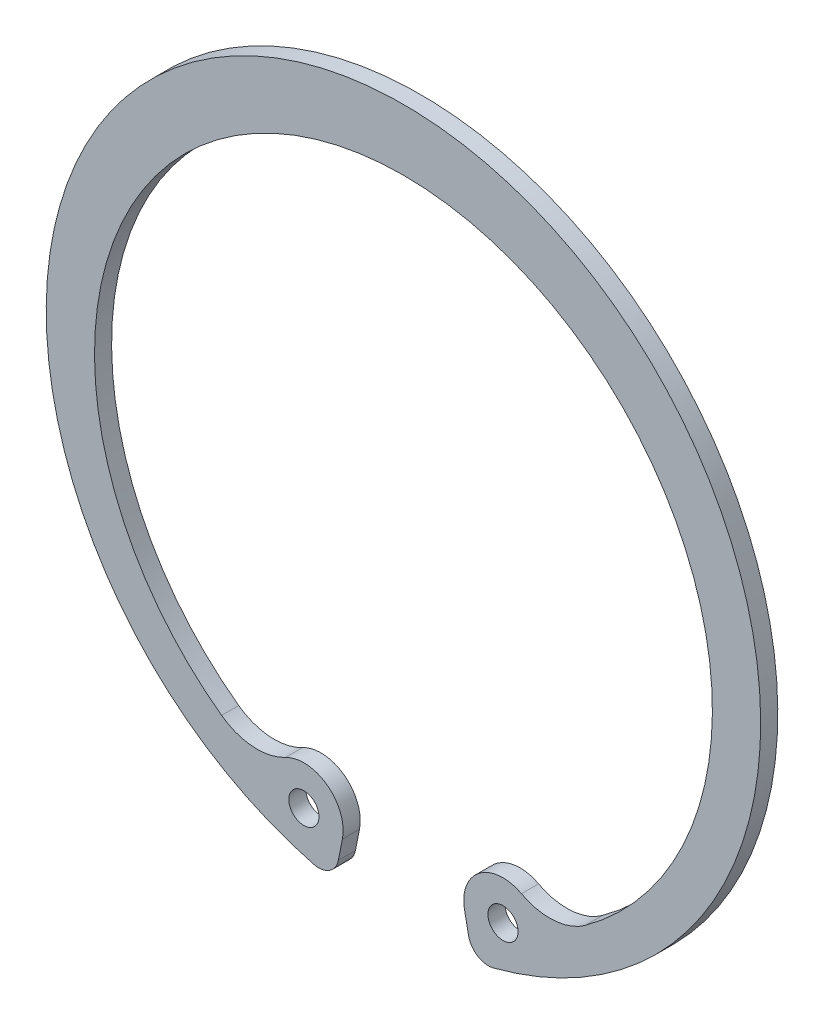
ISO-10303-21;
HEADER;
FILE_DESCRIPTION(('STEP AP214'),'2;1');
FILE_NAME('part.step','',(''),(''),'','','');
FILE_SCHEMA(('AUTOMOTIVE_DESIGN { 1 0 10303 214 1 1 1 1 }'));
ENDSEC;
DATA;
#1=APPLICATION_CONTEXT('core data for automotive mechanical design processes');
#2=APPLICATION_PROTOCOL_DEFINITION('international standard','automotive_design',2000,#1);
#3=PRODUCT_CONTEXT('',#1,'mechanical');
#4=PRODUCT('Part','Part','',(#3));
#5=PRODUCT_RELATED_PRODUCT_CATEGORY('part','',(#4));
#6=PRODUCT_DEFINITION_FORMATION('','',#4);
#7=PRODUCT_DEFINITION_CONTEXT('part definition',#1,'design');
#8=PRODUCT_DEFINITION('design','',#6,#7);
#9=PRODUCT_DEFINITION_SHAPE('','',#8);
#10=(LENGTH_UNIT() NAMED_UNIT(*) SI_UNIT(.MILLI.,.METRE.));
#11=(NAMED_UNIT(*) PLANE_ANGLE_UNIT() SI_UNIT($,.RADIAN.));
#12=(NAMED_UNIT(*) SI_UNIT($,.STERADIAN.) SOLID_ANGLE_UNIT());
#13=UNCERTAINTY_MEASURE_WITH_UNIT(LENGTH_MEASURE(1.E-05),#10,'distance_accuracy_value','');
#14=(GEOMETRIC_REPRESENTATION_CONTEXT(3) GLOBAL_UNCERTAINTY_ASSIGNED_CONTEXT((#13)) GLOBAL_UNIT_ASSIGNED_CONTEXT((#10,
#11,#12)) REPRESENTATION_CONTEXT('',''));
#15=CARTESIAN_POINT('',(0.,0.,0.));
#16=DIRECTION('',(0.,0.,1.));
#17=DIRECTION('',(1.,0.,0.));
#18=AXIS2_PLACEMENT_3D('',#15,#16,#17);
#19=CARTESIAN_POINT('',(-14.5407425987536,-21.2708650477625,1.7));
#20=DIRECTION('',(0.,0.,1.));
#21=DIRECTION('',(1.,0.,0.));
#22=AXIS2_PLACEMENT_3D('',#19,#20,#21);
#23=PLANE('',#22);
#24=CARTESIAN_POINT('',(-9.89414741037491,-30.012669961814,1.7));
#25=DIRECTION('',(0.,0.,1.));
#26=DIRECTION('',(1.,0.,0.));
#27=AXIS2_PLACEMENT_3D('',#24,#25,#26);
#28=CIRCLE('',#27,1.5);
#29=CARTESIAN_POINT('',(-8.39414741037491,-30.012669961814,1.7));
#30=VERTEX_POINT('',#29);
#31=EDGE_CURVE('E147',#30,#30,#28,.T.);
#32=ORIENTED_EDGE('',*,*,#31,.F.);
#33=EDGE_LOOP('',(#32));
#34=FACE_BOUND('',#33,.T.);
#35=CARTESIAN_POINT('',(-14.5407425987536,-21.2708650477625,1.7));
#36=DIRECTION('',(0.,0.,-1.));
#37=DIRECTION('',(1.,0.,0.));
#38=AXIS2_PLACEMENT_3D('',#35,#36,#37);
#39=CIRCLE('',#38,6.00000000000003);
#40=CARTESIAN_POINT('',(-11.7246243027665,-26.5689286320362,1.7));
#41=VERTEX_POINT('',#40);
#42=CARTESIAN_POINT('',(-18.0726208705647,-26.1212089400148,1.7));
#43=VERTEX_POINT('',#42);
#44=EDGE_CURVE('E162',#41,#43,#39,.T.);
#45=ORIENTED_EDGE('',*,*,#44,.T.);
#46=CARTESIAN_POINT('',(0.,-1.30199958159483,1.7));
#47=DIRECTION('',(0.,0.,-1.));
#48=DIRECTION('',(1.,0.,0.));
#49=AXIS2_PLACEMENT_3D('',#46,#47,#48);
#50=CIRCLE('',#49,30.7019995815949);
#51=CARTESIAN_POINT('',(18.0726208705647,-26.1212089400148,1.7));
#52=VERTEX_POINT('',#51);
#53=EDGE_CURVE('E100',#43,#52,#50,.T.);
#54=ORIENTED_EDGE('',*,*,#53,.T.);
#55=CARTESIAN_POINT('',(14.5407425987536,-21.2708650477625,1.7));
#56=DIRECTION('',(0.,0.,-1.));
#57=DIRECTION('',(-1.,0.,0.));
#58=AXIS2_PLACEMENT_3D('',#55,#56,#57);
#59=CIRCLE('',#58,6.00000000000003);
#60=CARTESIAN_POINT('',(11.7246243027665,-26.5689286320362,1.7));
#61=VERTEX_POINT('',#60);
#62=EDGE_CURVE('E183',#52,#61,#59,.T.);
#63=ORIENTED_EDGE('',*,*,#62,.T.);
#64=CARTESIAN_POINT('',(9.89414741037491,-30.012669961814,1.7));
#65=DIRECTION('',(0.,0.,1.));
#66=DIRECTION('',(-1.,0.,0.));
#67=AXIS2_PLACEMENT_3D('',#64,#65,#66);
#68=CIRCLE('',#67,3.9);
#69=CARTESIAN_POINT('',(6.06890658915215,-30.7726256576615,1.7));
#70=VERTEX_POINT('',#69);
#71=EDGE_CURVE('E202',#61,#70,#68,.T.);
#72=ORIENTED_EDGE('',*,*,#71,.T.);
#73=DIRECTION('',(0.194860434832676,-0.98083097980071,0.));
#74=VECTOR('',#73,1.);
#75=CARTESIAN_POINT('',(6.47372941912589,-32.8103034105096,1.7));
#76=LINE('',#75,#74);
#77=CARTESIAN_POINT('',(6.47372941912589,-32.8103034105096,1.7));
#78=VERTEX_POINT('',#77);
#79=EDGE_CURVE('E199',#70,#78,#76,.T.);
#80=ORIENTED_EDGE('',*,*,#79,.T.);
#81=CARTESIAN_POINT('',(8.43539137872731,-32.4205825408442,1.7));
#82=DIRECTION('',(0.,0.,1.));
#83=DIRECTION('',(-1.,0.,0.));
#84=AXIS2_PLACEMENT_3D('',#81,#82,#83);
#85=CIRCLE('',#84,2.);
#86=CARTESIAN_POINT('',(8.93899683417372,-34.3561397074618,1.7));
#87=VERTEX_POINT('',#86);
#88=EDGE_CURVE('E201',#78,#87,#85,.T.);
#89=ORIENTED_EDGE('',*,*,#88,.T.);
#90=CARTESIAN_POINT('',(0.,0.,1.7));
#91=DIRECTION('',(0.,0.,1.));
#92=DIRECTION('',(1.,0.,0.));
#93=AXIS2_PLACEMENT_3D('',#90,#91,#92);
#94=CIRCLE('',#93,35.5);
#95=CARTESIAN_POINT('',(-8.93899683417372,-34.3561397074618,1.7));
#96=VERTEX_POINT('',#95);
#97=EDGE_CURVE('E125',#87,#96,#94,.T.);
#98=ORIENTED_EDGE('',*,*,#97,.T.);
#99=CARTESIAN_POINT('',(-8.43539137872731,-32.4205825408442,1.7));
#100=DIRECTION('',(0.,0.,1.));
#101=DIRECTION('',(1.,0.,0.));
#102=AXIS2_PLACEMENT_3D('',#99,#100,#101);
#103=CIRCLE('',#102,2.);
#104=CARTESIAN_POINT('',(-6.47372941912589,-32.8103034105096,1.7));
#105=VERTEX_POINT('',#104);
#106=EDGE_CURVE('E119',#96,#105,#103,.T.);
#107=ORIENTED_EDGE('',*,*,#106,.T.);
#108=DIRECTION('',(0.194860434832676,0.98083097980071,0.));
#109=VECTOR('',#108,1.);
#110=CARTESIAN_POINT('',(-6.47372941912589,-32.8103034105096,1.7));
#111=LINE('',#110,#109);
#112=CARTESIAN_POINT('',(-6.06890658915215,-30.7726256576615,1.7));
#113=VERTEX_POINT('',#112);
#114=EDGE_CURVE('E123',#105,#113,#111,.T.);
#115=ORIENTED_EDGE('',*,*,#114,.T.);
#116=CARTESIAN_POINT('',(-9.89414741037491,-30.012669961814,1.7));
#117=DIRECTION('',(0.,0.,1.));
#118=DIRECTION('',(1.,0.,0.));
#119=AXIS2_PLACEMENT_3D('',#116,#117,#118);
#120=CIRCLE('',#119,3.9);
#121=EDGE_CURVE('E51',#113,#41,#120,.T.);
#122=ORIENTED_EDGE('',*,*,#121,.T.);
#123=EDGE_LOOP('',(#45,#54,#63,#72,#80,#89,#98,#107,#115,#122));
#124=FACE_BOUND('',#123,.T.);
#125=CARTESIAN_POINT('',(9.89414741037491,-30.012669961814,1.7));
#126=DIRECTION('',(0.,0.,1.));
#127=DIRECTION('',(-1.,0.,0.));
#128=AXIS2_PLACEMENT_3D('',#125,#126,#127);
#129=CIRCLE('',#128,1.5);
#130=CARTESIAN_POINT('',(8.39414741037491,-30.012669961814,1.7));
#131=VERTEX_POINT('',#130);
#132=EDGE_CURVE('E213',#131,#131,#129,.T.);
#133=ORIENTED_EDGE('',*,*,#132,.F.);
#134=EDGE_LOOP('',(#133));
#135=FACE_BOUND('',#134,.T.);
#136=ADVANCED_FACE('F34',(#34,#124,#135),#23,.T.);
#137=CARTESIAN_POINT('',(-14.5407425987536,-21.2708650477625,0.));
#138=DIRECTION('',(0.,0.,1.));
#139=DIRECTION('',(1.,0.,0.));
#140=AXIS2_PLACEMENT_3D('',#137,#138,#139);
#141=PLANE('',#140);
#142=CARTESIAN_POINT('',(-14.5407425987536,-21.2708650477625,0.));
#143=DIRECTION('',(0.,0.,-1.));
#144=DIRECTION('',(1.,0.,0.));
#145=AXIS2_PLACEMENT_3D('',#142,#143,#144);
#146=CIRCLE('',#145,6.00000000000003);
#147=CARTESIAN_POINT('',(-11.7246243027665,-26.5689286320362,0.));
#148=VERTEX_POINT('',#147);
#149=CARTESIAN_POINT('',(-18.0726208705647,-26.1212089400148,0.));
#150=VERTEX_POINT('',#149);
#151=EDGE_CURVE('E143',#148,#150,#146,.T.);
#152=ORIENTED_EDGE('',*,*,#151,.F.);
#153=CARTESIAN_POINT('',(-9.89414741037491,-30.012669961814,0.));
#154=DIRECTION('',(0.,0.,1.));
#155=DIRECTION('',(1.,0.,0.));
#156=AXIS2_PLACEMENT_3D('',#153,#154,#155);
#157=CIRCLE('',#156,3.9);
#158=CARTESIAN_POINT('',(-6.06890658915215,-30.7726256576615,0.));
#159=VERTEX_POINT('',#158);
#160=EDGE_CURVE('E92',#159,#148,#157,.T.);
#161=ORIENTED_EDGE('',*,*,#160,.F.);
#162=DIRECTION('',(0.194860434832676,0.98083097980071,0.));
#163=VECTOR('',#162,1.);
#164=CARTESIAN_POINT('',(-6.47372941912589,-32.8103034105096,0.));
#165=LINE('',#164,#163);
#166=CARTESIAN_POINT('',(-6.47372941912589,-32.8103034105096,0.));
#167=VERTEX_POINT('',#166);
#168=EDGE_CURVE('E86',#167,#159,#165,.T.);
#169=ORIENTED_EDGE('',*,*,#168,.F.);
#170=CARTESIAN_POINT('',(-8.43539137872731,-32.4205825408442,0.));
#171=DIRECTION('',(0.,0.,1.));
#172=DIRECTION('',(1.,0.,0.));
#173=AXIS2_PLACEMENT_3D('',#170,#171,#172);
#174=CIRCLE('',#173,2.);
#175=CARTESIAN_POINT('',(-8.93899683417372,-34.3561397074618,0.));
#176=VERTEX_POINT('',#175);
#177=EDGE_CURVE('E133',#176,#167,#174,.T.);
#178=ORIENTED_EDGE('',*,*,#177,.F.);
#179=CARTESIAN_POINT('',(0.,0.,0.));
#180=DIRECTION('',(0.,0.,1.));
#181=DIRECTION('',(1.,0.,0.));
#182=AXIS2_PLACEMENT_3D('',#179,#180,#181);
#183=CIRCLE('',#182,35.5);
#184=CARTESIAN_POINT('',(8.93899683417372,-34.3561397074618,0.));
#185=VERTEX_POINT('',#184);
#186=EDGE_CURVE('E157',#185,#176,#183,.T.);
#187=ORIENTED_EDGE('',*,*,#186,.F.);
#188=CARTESIAN_POINT('',(8.43539137872731,-32.4205825408442,0.));
#189=DIRECTION('',(0.,0.,1.));
#190=DIRECTION('',(-1.,0.,0.));
#191=AXIS2_PLACEMENT_3D('',#188,#189,#190);
#192=CIRCLE('',#191,2.);
#193=CARTESIAN_POINT('',(6.47372941912589,-32.8103034105096,0.));
#194=VERTEX_POINT('',#193);
#195=EDGE_CURVE('E155',#194,#185,#192,.T.);
#196=ORIENTED_EDGE('',*,*,#195,.F.);
#197=DIRECTION('',(0.194860434832676,-0.98083097980071,0.));
#198=VECTOR('',#197,1.);
#199=CARTESIAN_POINT('',(6.47372941912589,-32.8103034105096,0.));
#200=LINE('',#199,#198);
#201=CARTESIAN_POINT('',(6.06890658915215,-30.7726256576615,0.));
#202=VERTEX_POINT('',#201);
#203=EDGE_CURVE('E153',#202,#194,#200,.T.);
#204=ORIENTED_EDGE('',*,*,#203,.F.);
#205=CARTESIAN_POINT('',(9.89414741037491,-30.012669961814,0.));
#206=DIRECTION('',(0.,0.,1.));
#207=DIRECTION('',(-1.,0.,0.));
#208=AXIS2_PLACEMENT_3D('',#205,#206,#207);
#209=CIRCLE('',#208,3.9);
#210=CARTESIAN_POINT('',(11.7246243027665,-26.5689286320362,0.));
#211=VERTEX_POINT('',#210);
#212=EDGE_CURVE('E151',#211,#202,#209,.T.);
#213=ORIENTED_EDGE('',*,*,#212,.F.);
#214=CARTESIAN_POINT('',(14.5407425987536,-21.2708650477625,0.));
#215=DIRECTION('',(0.,0.,-1.));
#216=DIRECTION('',(-1.,0.,0.));
#217=AXIS2_PLACEMENT_3D('',#214,#215,#216);
#218=CIRCLE('',#217,6.00000000000003);
#219=CARTESIAN_POINT('',(18.0726208705647,-26.1212089400148,0.));
#220=VERTEX_POINT('',#219);
#221=EDGE_CURVE('E149',#220,#211,#218,.T.);
#222=ORIENTED_EDGE('',*,*,#221,.F.);
#223=CARTESIAN_POINT('',(0.,-1.30199958159483,0.));
#224=DIRECTION('',(0.,0.,-1.));
#225=DIRECTION('',(1.,0.,0.));
#226=AXIS2_PLACEMENT_3D('',#223,#224,#225);
#227=CIRCLE('',#226,30.7019995815949);
#228=EDGE_CURVE('E146',#150,#220,#227,.T.);
#229=ORIENTED_EDGE('',*,*,#228,.F.);
#230=EDGE_LOOP('',(#152,#161,#169,#178,#187,#196,#204,#213,#222,#229));
#231=FACE_BOUND('',#230,.T.);
#232=CARTESIAN_POINT('',(-9.89414741037491,-30.012669961814,0.));
#233=DIRECTION('',(0.,0.,1.));
#234=DIRECTION('',(1.,0.,0.));
#235=AXIS2_PLACEMENT_3D('',#232,#233,#234);
#236=CIRCLE('',#235,1.5);
#237=CARTESIAN_POINT('',(-8.39414741037491,-30.012669961814,0.));
#238=VERTEX_POINT('',#237);
#239=EDGE_CURVE('E210',#238,#238,#236,.T.);
#240=ORIENTED_EDGE('',*,*,#239,.T.);
#241=EDGE_LOOP('',(#240));
#242=FACE_BOUND('',#241,.T.);
#243=CARTESIAN_POINT('',(9.89414741037491,-30.012669961814,0.));
#244=DIRECTION('',(0.,0.,1.));
#245=DIRECTION('',(-1.,0.,0.));
#246=AXIS2_PLACEMENT_3D('',#243,#244,#245);
#247=CIRCLE('',#246,1.5);
#248=CARTESIAN_POINT('',(8.39414741037491,-30.012669961814,0.));
#249=VERTEX_POINT('',#248);
#250=EDGE_CURVE('E216',#249,#249,#247,.T.);
#251=ORIENTED_EDGE('',*,*,#250,.T.);
#252=EDGE_LOOP('',(#251));
#253=FACE_BOUND('',#252,.T.);
#254=ADVANCED_FACE('F187',(#231,#242,#253),#141,.F.);
#255=CARTESIAN_POINT('',(-14.5407425987536,-21.2708650477625,1.7));
#256=DIRECTION('',(0.,0.,-1.));
#257=DIRECTION('',(-1.,0.,0.));
#258=AXIS2_PLACEMENT_3D('',#255,#256,#257);
#259=CYLINDRICAL_SURFACE('',#258,6.00000000000003);
#260=ORIENTED_EDGE('',*,*,#151,.T.);
#261=DIRECTION('',(0.,0.,-1.));
#262=VECTOR('',#261,1.);
#263=CARTESIAN_POINT('',(-18.0726208705647,-26.1212089400148,1.7));
#264=LINE('',#263,#262);
#265=EDGE_CURVE('E11',#43,#150,#264,.T.);
#266=ORIENTED_EDGE('',*,*,#265,.F.);
#267=ORIENTED_EDGE('',*,*,#44,.F.);
#268=DIRECTION('',(0.,0.,-1.));
#269=VECTOR('',#268,1.);
#270=CARTESIAN_POINT('',(-11.7246243027665,-26.5689286320362,1.7));
#271=LINE('',#270,#269);
#272=EDGE_CURVE('E139',#41,#148,#271,.T.);
#273=ORIENTED_EDGE('',*,*,#272,.T.);
#274=EDGE_LOOP('',(#260,#266,#267,#273));
#275=FACE_BOUND('',#274,.T.);
#276=ADVANCED_FACE('F36',(#275),#259,.F.);
#277=CARTESIAN_POINT('',(0.,-1.30199958159483,1.7));
#278=DIRECTION('',(0.,0.,-1.));
#279=DIRECTION('',(-1.,0.,0.));
#280=AXIS2_PLACEMENT_3D('',#277,#278,#279);
#281=CYLINDRICAL_SURFACE('',#280,30.7019995815949);
#282=ORIENTED_EDGE('',*,*,#228,.T.);
#283=DIRECTION('',(0.,0.,-1.));
#284=VECTOR('',#283,1.);
#285=CARTESIAN_POINT('',(18.0726208705647,-26.1212089400148,1.7));
#286=LINE('',#285,#284);
#287=EDGE_CURVE('E43',#52,#220,#286,.T.);
#288=ORIENTED_EDGE('',*,*,#287,.F.);
#289=ORIENTED_EDGE('',*,*,#53,.F.);
#290=ORIENTED_EDGE('',*,*,#265,.T.);
#291=EDGE_LOOP('',(#282,#288,#289,#290));
#292=FACE_BOUND('',#291,.T.);
#293=ADVANCED_FACE('F256',(#292),#281,.F.);
#294=CARTESIAN_POINT('',(14.5407425987536,-21.2708650477625,1.7));
#295=DIRECTION('',(0.,0.,-1.));
#296=DIRECTION('',(-1.,0.,0.));
#297=AXIS2_PLACEMENT_3D('',#294,#295,#296);
#298=CYLINDRICAL_SURFACE('',#297,6.00000000000003);
#299=ORIENTED_EDGE('',*,*,#221,.T.);
#300=DIRECTION('',(0.,0.,-1.));
#301=VECTOR('',#300,1.);
#302=CARTESIAN_POINT('',(11.7246243027665,-26.5689286320362,1.7));
#303=LINE('',#302,#301);
#304=EDGE_CURVE('E175',#61,#211,#303,.T.);
#305=ORIENTED_EDGE('',*,*,#304,.F.);
#306=ORIENTED_EDGE('',*,*,#62,.F.);
#307=ORIENTED_EDGE('',*,*,#287,.T.);
#308=EDGE_LOOP('',(#299,#305,#306,#307));
#309=FACE_BOUND('',#308,.T.);
#310=ADVANCED_FACE('F181',(#309),#298,.F.);
#311=CARTESIAN_POINT('',(9.89414741037491,-30.012669961814,1.7));
#312=DIRECTION('',(0.,0.,-1.));
#313=DIRECTION('',(-1.,0.,0.));
#314=AXIS2_PLACEMENT_3D('',#311,#312,#313);
#315=CYLINDRICAL_SURFACE('',#314,3.9);
#316=ORIENTED_EDGE('',*,*,#212,.T.);
#317=DIRECTION('',(0.,0.,-1.));
#318=VECTOR('',#317,1.);
#319=CARTESIAN_POINT('',(6.06890658915215,-30.7726256576615,1.7));
#320=LINE('',#319,#318);
#321=EDGE_CURVE('E172',#70,#202,#320,.T.);
#322=ORIENTED_EDGE('',*,*,#321,.F.);
#323=ORIENTED_EDGE('',*,*,#71,.F.);
#324=ORIENTED_EDGE('',*,*,#304,.T.);
#325=EDGE_LOOP('',(#316,#322,#323,#324));
#326=FACE_BOUND('',#325,.T.);
#327=ADVANCED_FACE('F193',(#326),#315,.T.);
#328=CARTESIAN_POINT('',(6.47372941912589,-32.8103034105096,1.7));
#329=DIRECTION('',(0.98083097980071,0.194860434832676,0.));
#330=DIRECTION('',(-0.194860434832676,0.98083097980071,0.));
#331=AXIS2_PLACEMENT_3D('',#328,#329,#330);
#332=PLANE('',#331);
#333=ORIENTED_EDGE('',*,*,#203,.T.);
#334=DIRECTION('',(0.,0.,-1.));
#335=VECTOR('',#334,1.);
#336=CARTESIAN_POINT('',(6.47372941912589,-32.8103034105096,1.7));
#337=LINE('',#336,#335);
#338=EDGE_CURVE('E169',#78,#194,#337,.T.);
#339=ORIENTED_EDGE('',*,*,#338,.F.);
#340=ORIENTED_EDGE('',*,*,#79,.F.);
#341=ORIENTED_EDGE('',*,*,#321,.T.);
#342=EDGE_LOOP('',(#333,#339,#340,#341));
#343=FACE_BOUND('',#342,.T.);
#344=ADVANCED_FACE('F197',(#343),#332,.F.);
#345=CARTESIAN_POINT('',(8.43539137872731,-32.4205825408442,1.7));
#346=DIRECTION('',(0.,0.,-1.));
#347=DIRECTION('',(-1.,0.,0.));
#348=AXIS2_PLACEMENT_3D('',#345,#346,#347);
#349=CYLINDRICAL_SURFACE('',#348,2.);
#350=ORIENTED_EDGE('',*,*,#195,.T.);
#351=DIRECTION('',(0.,0.,-1.));
#352=VECTOR('',#351,1.);
#353=CARTESIAN_POINT('',(8.93899683417372,-34.3561397074618,1.7));
#354=LINE('',#353,#352);
#355=EDGE_CURVE('E166',#87,#185,#354,.T.);
#356=ORIENTED_EDGE('',*,*,#355,.F.);
#357=ORIENTED_EDGE('',*,*,#88,.F.);
#358=ORIENTED_EDGE('',*,*,#338,.T.);
#359=EDGE_LOOP('',(#350,#356,#357,#358));
#360=FACE_BOUND('',#359,.T.);
#361=ADVANCED_FACE('F246',(#360),#349,.T.);
#362=CARTESIAN_POINT('',(0.,0.,1.7));
#363=DIRECTION('',(0.,0.,-1.));
#364=DIRECTION('',(-1.,0.,0.));
#365=AXIS2_PLACEMENT_3D('',#362,#363,#364);
#366=CYLINDRICAL_SURFACE('',#365,35.5);
#367=ORIENTED_EDGE('',*,*,#186,.T.);
#368=DIRECTION('',(0.,0.,-1.));
#369=VECTOR('',#368,1.);
#370=CARTESIAN_POINT('',(-8.93899683417372,-34.3561397074618,1.7));
#371=LINE('',#370,#369);
#372=EDGE_CURVE('E134',#96,#176,#371,.T.);
#373=ORIENTED_EDGE('',*,*,#372,.F.);
#374=ORIENTED_EDGE('',*,*,#97,.F.);
#375=ORIENTED_EDGE('',*,*,#355,.T.);
#376=EDGE_LOOP('',(#367,#373,#374,#375));
#377=FACE_BOUND('',#376,.T.);
#378=ADVANCED_FACE('F243',(#377),#366,.T.);
#379=CARTESIAN_POINT('',(-8.43539137872731,-32.4205825408442,1.7));
#380=DIRECTION('',(0.,0.,-1.));
#381=DIRECTION('',(-1.,0.,0.));
#382=AXIS2_PLACEMENT_3D('',#379,#380,#381);
#383=CYLINDRICAL_SURFACE('',#382,2.);
#384=ORIENTED_EDGE('',*,*,#177,.T.);
#385=DIRECTION('',(0.,0.,-1.));
#386=VECTOR('',#385,1.);
#387=CARTESIAN_POINT('',(-6.47372941912589,-32.8103034105096,1.7));
#388=LINE('',#387,#386);
#389=EDGE_CURVE('E130',#105,#167,#388,.T.);
#390=ORIENTED_EDGE('',*,*,#389,.F.);
#391=ORIENTED_EDGE('',*,*,#106,.F.);
#392=ORIENTED_EDGE('',*,*,#372,.T.);
#393=EDGE_LOOP('',(#384,#390,#391,#392));
#394=FACE_BOUND('',#393,.T.);
#395=ADVANCED_FACE('F131',(#394),#383,.T.);
#396=CARTESIAN_POINT('',(-6.47372941912589,-32.8103034105096,1.7));
#397=DIRECTION('',(-0.98083097980071,0.194860434832676,0.));
#398=DIRECTION('',(-0.194860434832676,-0.98083097980071,0.));
#399=AXIS2_PLACEMENT_3D('',#396,#397,#398);
#400=PLANE('',#399);
#401=ORIENTED_EDGE('',*,*,#168,.T.);
#402=DIRECTION('',(0.,0.,-1.));
#403=VECTOR('',#402,1.);
#404=CARTESIAN_POINT('',(-6.06890658915215,-30.7726256576615,1.7));
#405=LINE('',#404,#403);
#406=EDGE_CURVE('E135',#113,#159,#405,.T.);
#407=ORIENTED_EDGE('',*,*,#406,.F.);
#408=ORIENTED_EDGE('',*,*,#114,.F.);
#409=ORIENTED_EDGE('',*,*,#389,.T.);
#410=EDGE_LOOP('',(#401,#407,#408,#409));
#411=FACE_BOUND('',#410,.T.);
#412=ADVANCED_FACE('F137',(#411),#400,.F.);
#413=CARTESIAN_POINT('',(-9.89414741037491,-30.012669961814,1.7));
#414=DIRECTION('',(0.,0.,-1.));
#415=DIRECTION('',(-1.,0.,0.));
#416=AXIS2_PLACEMENT_3D('',#413,#414,#415);
#417=CYLINDRICAL_SURFACE('',#416,3.9);
#418=ORIENTED_EDGE('',*,*,#160,.T.);
#419=ORIENTED_EDGE('',*,*,#272,.F.);
#420=ORIENTED_EDGE('',*,*,#121,.F.);
#421=ORIENTED_EDGE('',*,*,#406,.T.);
#422=EDGE_LOOP('',(#418,#419,#420,#421));
#423=FACE_BOUND('',#422,.T.);
#424=ADVANCED_FACE('F236',(#423),#417,.T.);
#425=CARTESIAN_POINT('',(-9.89414741037491,-30.012669961814,1.7));
#426=DIRECTION('',(0.,0.,-1.));
#427=DIRECTION('',(-1.,0.,0.));
#428=AXIS2_PLACEMENT_3D('',#425,#426,#427);
#429=CYLINDRICAL_SURFACE('',#428,1.5);
#430=ORIENTED_EDGE('',*,*,#31,.T.);
#431=EDGE_LOOP('',(#430));
#432=FACE_BOUND('',#431,.T.);
#433=ORIENTED_EDGE('',*,*,#239,.F.);
#434=EDGE_LOOP('',(#433));
#435=FACE_BOUND('',#434,.T.);
#436=ADVANCED_FACE('F233',(#432,#435),#429,.F.);
#437=CARTESIAN_POINT('',(9.89414741037491,-30.012669961814,1.7));
#438=DIRECTION('',(0.,0.,-1.));
#439=DIRECTION('',(-1.,0.,0.));
#440=AXIS2_PLACEMENT_3D('',#437,#438,#439);
#441=CYLINDRICAL_SURFACE('',#440,1.5);
#442=ORIENTED_EDGE('',*,*,#132,.T.);
#443=EDGE_LOOP('',(#442));
#444=FACE_BOUND('',#443,.T.);
#445=ORIENTED_EDGE('',*,*,#250,.F.);
#446=EDGE_LOOP('',(#445));
#447=FACE_BOUND('',#446,.T.);
#448=ADVANCED_FACE('F222',(#444,#447),#441,.F.);
#449=CLOSED_SHELL('',(#136,#254,#276,#293,#310,#327,#344,#361,#378,#395,#412,#424,#436,#448));
#450=MANIFOLD_SOLID_BREP('B2',#449);
#451=ADVANCED_BREP_SHAPE_REPRESENTATION('',(#18,#450),#14);
#452=SHAPE_DEFINITION_REPRESENTATION(#9,#451);
ENDSEC;
END-ISO-10303-21;
